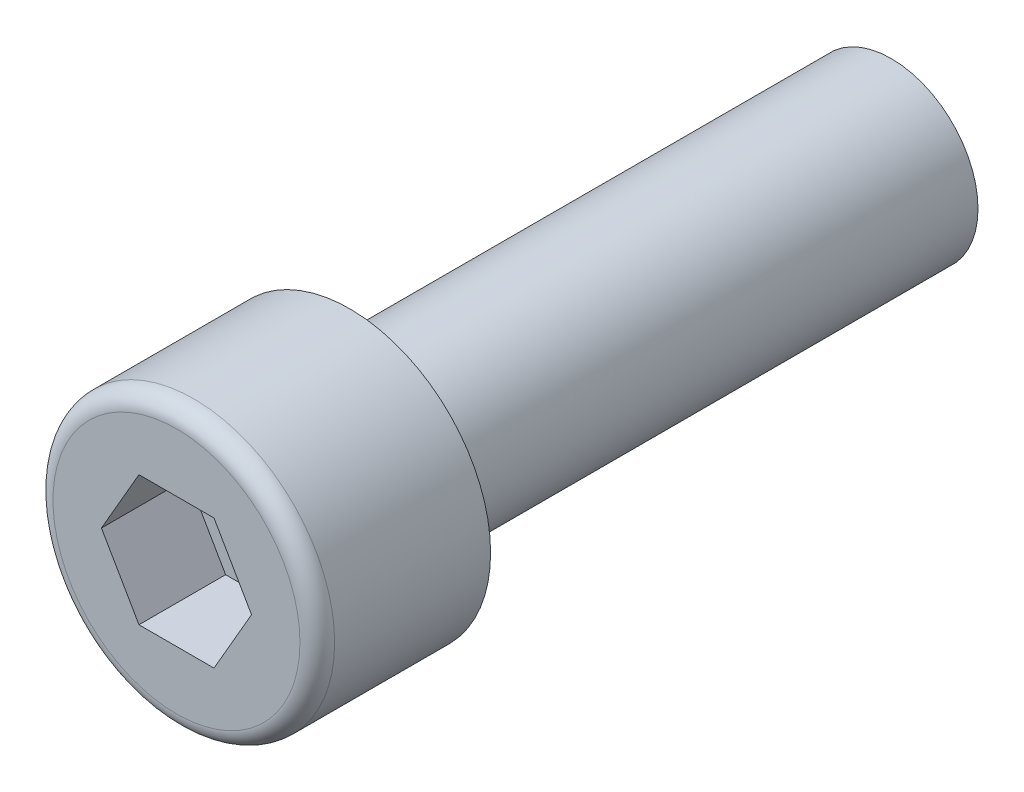
ISO-10303-21;
HEADER;
FILE_DESCRIPTION(('STEP AP214'),'2;1');
FILE_NAME('part.step','',(''),(''),'','','');
FILE_SCHEMA(('AUTOMOTIVE_DESIGN { 1 0 10303 214 1 1 1 1 }'));
ENDSEC;
DATA;
#1=APPLICATION_CONTEXT('core data for automotive mechanical design processes');
#2=APPLICATION_PROTOCOL_DEFINITION('international standard','automotive_design',2000,#1);
#3=PRODUCT_CONTEXT('',#1,'mechanical');
#4=PRODUCT('Part','Part','',(#3));
#5=PRODUCT_RELATED_PRODUCT_CATEGORY('part','',(#4));
#6=PRODUCT_DEFINITION_FORMATION('','',#4);
#7=PRODUCT_DEFINITION_CONTEXT('part definition',#1,'design');
#8=PRODUCT_DEFINITION('design','',#6,#7);
#9=PRODUCT_DEFINITION_SHAPE('','',#8);
#10=(LENGTH_UNIT() NAMED_UNIT(*) SI_UNIT(.MILLI.,.METRE.));
#11=(NAMED_UNIT(*) PLANE_ANGLE_UNIT() SI_UNIT($,.RADIAN.));
#12=(NAMED_UNIT(*) SI_UNIT($,.STERADIAN.) SOLID_ANGLE_UNIT());
#13=UNCERTAINTY_MEASURE_WITH_UNIT(LENGTH_MEASURE(1.E-05),#10,'distance_accuracy_value','');
#14=(GEOMETRIC_REPRESENTATION_CONTEXT(3) GLOBAL_UNCERTAINTY_ASSIGNED_CONTEXT((#13)) GLOBAL_UNIT_ASSIGNED_CONTEXT((#10,
#11,#12)) REPRESENTATION_CONTEXT('',''));
#15=CARTESIAN_POINT('',(0.,0.,0.));
#16=DIRECTION('',(0.,0.,1.));
#17=DIRECTION('',(1.,0.,0.));
#18=AXIS2_PLACEMENT_3D('',#15,#16,#17);
#19=CARTESIAN_POINT('',(0.,0.,8.));
#20=DIRECTION('',(0.,0.,1.));
#21=DIRECTION('',(1.,0.,0.));
#22=AXIS2_PLACEMENT_3D('',#19,#20,#21);
#23=PLANE('',#22);
#24=DIRECTION('',(-0.500000000000081,-0.866025403784392,0.));
#25=VECTOR('',#24,1.);
#26=CARTESIAN_POINT('',(-1.73205080786937,3.00000000017349,8.000000000254));
#27=LINE('',#26,#25);
#28=CARTESIAN_POINT('',(-1.73205080756888,3.,8.));
#29=VERTEX_POINT('',#28);
#30=CARTESIAN_POINT('',(-3.46410161513775,0.,8.));
#31=VERTEX_POINT('',#30);
#32=EDGE_CURVE('E82',#29,#31,#27,.T.);
#33=ORIENTED_EDGE('',*,*,#32,.F.);
#34=DIRECTION('',(-1.,0.,0.));
#35=VECTOR('',#34,1.);
#36=CARTESIAN_POINT('',(1.73205080756888,3.000000000254,8.000000000254));
#37=LINE('',#36,#35);
#38=CARTESIAN_POINT('',(1.73205080756888,3.,8.));
#39=VERTEX_POINT('',#38);
#40=EDGE_CURVE('E70',#39,#29,#37,.T.);
#41=ORIENTED_EDGE('',*,*,#40,.F.);
#42=DIRECTION('',(-0.50000000000008,0.866025403784392,0.));
#43=VECTOR('',#42,1.);
#44=CARTESIAN_POINT('',(3.46410161543824,1.73488829304525E-10,8.000000000254));
#45=LINE('',#44,#43);
#46=CARTESIAN_POINT('',(3.46410161513775,0.,8.));
#47=VERTEX_POINT('',#46);
#48=EDGE_CURVE('E81',#47,#39,#45,.T.);
#49=ORIENTED_EDGE('',*,*,#48,.F.);
#50=DIRECTION('',(0.500000000000081,0.866025403784392,0.));
#51=VECTOR('',#50,1.);
#52=CARTESIAN_POINT('',(1.73205080786937,-3.00000000017349,8.000000000254));
#53=LINE('',#52,#51);
#54=CARTESIAN_POINT('',(1.73205080756888,-3.,8.));
#55=VERTEX_POINT('',#54);
#56=EDGE_CURVE('E109',#55,#47,#53,.T.);
#57=ORIENTED_EDGE('',*,*,#56,.F.);
#58=DIRECTION('',(1.,2.54215667139907E-13,0.));
#59=VECTOR('',#58,1.);
#60=CARTESIAN_POINT('',(-1.73205080756888,-3.000000000254,8.000000000254));
#61=LINE('',#60,#59);
#62=CARTESIAN_POINT('',(-1.73205080756888,-3.,8.));
#63=VERTEX_POINT('',#62);
#64=EDGE_CURVE('E114',#63,#55,#61,.T.);
#65=ORIENTED_EDGE('',*,*,#64,.F.);
#66=DIRECTION('',(0.50000000000008,-0.866025403784392,0.));
#67=VECTOR('',#66,1.);
#68=CARTESIAN_POINT('',(-3.46410161521826,-4.64843630517229E-11,8.000000000254));
#69=LINE('',#68,#67);
#70=EDGE_CURVE('E96',#31,#63,#69,.T.);
#71=ORIENTED_EDGE('',*,*,#70,.F.);
#72=EDGE_LOOP('',(#33,#41,#49,#57,#65,#71));
#73=FACE_BOUND('',#72,.T.);
#74=CARTESIAN_POINT('',(0.,0.,8.));
#75=DIRECTION('',(0.,0.,1.));
#76=DIRECTION('',(1.,0.,0.));
#77=AXIS2_PLACEMENT_3D('',#74,#75,#76);
#78=CIRCLE('',#77,5.7);
#79=CARTESIAN_POINT('',(5.7,0.,8.));
#80=VERTEX_POINT('',#79);
#81=EDGE_CURVE('E123',#80,#80,#78,.T.);
#82=ORIENTED_EDGE('',*,*,#81,.T.);
#83=EDGE_LOOP('',(#82));
#84=FACE_BOUND('',#83,.T.);
#85=ADVANCED_FACE('F17',(#73,#84),#23,.T.);
#86=CARTESIAN_POINT('',(-1.73205080756888,3.,4.));
#87=DIRECTION('',(-0.866025403784439,0.5,0.));
#88=DIRECTION('',(0.,0.,1.));
#89=AXIS2_PLACEMENT_3D('',#86,#87,#88);
#90=PLANE('',#89);
#91=ORIENTED_EDGE('',*,*,#32,.T.);
#92=DIRECTION('',(0.,0.,1.));
#93=VECTOR('',#92,1.);
#94=CARTESIAN_POINT('',(-3.46410161539175,2.54000863062855E-10,4.));
#95=LINE('',#94,#93);
#96=CARTESIAN_POINT('',(-3.46410161513775,0.,4.));
#97=VERTEX_POINT('',#96);
#98=EDGE_CURVE('E129',#97,#31,#95,.T.);
#99=ORIENTED_EDGE('',*,*,#98,.F.);
#100=DIRECTION('',(-0.500000000000081,-0.866025403784392,0.));
#101=VECTOR('',#100,1.);
#102=CARTESIAN_POINT('',(-1.73205080786937,3.00000000017349,4.000000000254));
#103=LINE('',#102,#101);
#104=CARTESIAN_POINT('',(-1.73205080756888,3.,4.));
#105=VERTEX_POINT('',#104);
#106=EDGE_CURVE('E89',#105,#97,#103,.T.);
#107=ORIENTED_EDGE('',*,*,#106,.F.);
#108=DIRECTION('',(0.,0.,1.));
#109=VECTOR('',#108,1.);
#110=CARTESIAN_POINT('',(-1.73205080782288,3.000000000254,4.));
#111=LINE('',#110,#109);
#112=EDGE_CURVE('E74',#105,#29,#111,.T.);
#113=ORIENTED_EDGE('',*,*,#112,.T.);
#114=EDGE_LOOP('',(#91,#99,#107,#113));
#115=FACE_BOUND('',#114,.T.);
#116=ADVANCED_FACE('F87',(#115),#90,.F.);
#117=CARTESIAN_POINT('',(1.73205080756888,3.,4.));
#118=DIRECTION('',(0.,1.,0.));
#119=DIRECTION('',(1.,0.,0.));
#120=AXIS2_PLACEMENT_3D('',#117,#118,#119);
#121=PLANE('',#120);
#122=ORIENTED_EDGE('',*,*,#40,.T.);
#123=ORIENTED_EDGE('',*,*,#112,.F.);
#124=DIRECTION('',(-1.,0.,0.));
#125=VECTOR('',#124,1.);
#126=CARTESIAN_POINT('',(1.73205080756888,3.000000000254,4.000000000254));
#127=LINE('',#126,#125);
#128=CARTESIAN_POINT('',(1.73205080756888,3.,4.));
#129=VERTEX_POINT('',#128);
#130=EDGE_CURVE('E91',#129,#105,#127,.T.);
#131=ORIENTED_EDGE('',*,*,#130,.F.);
#132=DIRECTION('',(0.,0.,1.));
#133=VECTOR('',#132,1.);
#134=CARTESIAN_POINT('',(1.73205080782288,3.000000000254,4.));
#135=LINE('',#134,#133);
#136=EDGE_CURVE('E76',#129,#39,#135,.T.);
#137=ORIENTED_EDGE('',*,*,#136,.T.);
#138=EDGE_LOOP('',(#122,#123,#131,#137));
#139=FACE_BOUND('',#138,.T.);
#140=ADVANCED_FACE('F72',(#139),#121,.F.);
#141=CARTESIAN_POINT('',(3.46410161513775,0.,4.));
#142=DIRECTION('',(0.866025403784439,0.5,0.));
#143=DIRECTION('',(0.,0.,-1.));
#144=AXIS2_PLACEMENT_3D('',#141,#142,#143);
#145=PLANE('',#144);
#146=ORIENTED_EDGE('',*,*,#48,.T.);
#147=ORIENTED_EDGE('',*,*,#136,.F.);
#148=DIRECTION('',(-0.50000000000008,0.866025403784392,0.));
#149=VECTOR('',#148,1.);
#150=CARTESIAN_POINT('',(3.46410161543824,1.73488829304525E-10,4.000000000254));
#151=LINE('',#150,#149);
#152=CARTESIAN_POINT('',(3.46410161513775,0.,4.));
#153=VERTEX_POINT('',#152);
#154=EDGE_CURVE('E146',#153,#129,#151,.T.);
#155=ORIENTED_EDGE('',*,*,#154,.F.);
#156=DIRECTION('',(0.,0.,1.));
#157=VECTOR('',#156,1.);
#158=CARTESIAN_POINT('',(3.46410161539175,2.54003661575938E-10,4.));
#159=LINE('',#158,#157);
#160=EDGE_CURVE('E151',#153,#47,#159,.T.);
#161=ORIENTED_EDGE('',*,*,#160,.T.);
#162=EDGE_LOOP('',(#146,#147,#155,#161));
#163=FACE_BOUND('',#162,.T.);
#164=ADVANCED_FACE('F225',(#163),#145,.F.);
#165=CARTESIAN_POINT('',(1.73205080756888,-3.,4.));
#166=DIRECTION('',(0.866025403784439,-0.5,0.));
#167=DIRECTION('',(0.,0.,-1.));
#168=AXIS2_PLACEMENT_3D('',#165,#166,#167);
#169=PLANE('',#168);
#170=ORIENTED_EDGE('',*,*,#56,.T.);
#171=ORIENTED_EDGE('',*,*,#160,.F.);
#172=DIRECTION('',(0.500000000000081,0.866025403784392,0.));
#173=VECTOR('',#172,1.);
#174=CARTESIAN_POINT('',(1.73205080786937,-3.00000000017349,4.000000000254));
#175=LINE('',#174,#173);
#176=CARTESIAN_POINT('',(1.73205080756888,-3.,4.));
#177=VERTEX_POINT('',#176);
#178=EDGE_CURVE('E157',#177,#153,#175,.T.);
#179=ORIENTED_EDGE('',*,*,#178,.F.);
#180=DIRECTION('',(0.,0.,1.));
#181=VECTOR('',#180,1.);
#182=CARTESIAN_POINT('',(1.73205080782288,-3.000000000254,4.));
#183=LINE('',#182,#181);
#184=EDGE_CURVE('E162',#177,#55,#183,.T.);
#185=ORIENTED_EDGE('',*,*,#184,.T.);
#186=EDGE_LOOP('',(#170,#171,#179,#185));
#187=FACE_BOUND('',#186,.T.);
#188=ADVANCED_FACE('F228',(#187),#169,.F.);
#189=CARTESIAN_POINT('',(-1.73205080756888,-3.,4.));
#190=DIRECTION('',(0.,-1.,0.));
#191=DIRECTION('',(0.,0.,-1.));
#192=AXIS2_PLACEMENT_3D('',#189,#190,#191);
#193=PLANE('',#192);
#194=ORIENTED_EDGE('',*,*,#64,.T.);
#195=ORIENTED_EDGE('',*,*,#184,.F.);
#196=DIRECTION('',(1.,2.54215667139907E-13,0.));
#197=VECTOR('',#196,1.);
#198=CARTESIAN_POINT('',(-1.73205080756888,-3.000000000254,4.000000000254));
#199=LINE('',#198,#197);
#200=CARTESIAN_POINT('',(-1.73205080756888,-3.,4.));
#201=VERTEX_POINT('',#200);
#202=EDGE_CURVE('E37',#201,#177,#199,.T.);
#203=ORIENTED_EDGE('',*,*,#202,.F.);
#204=DIRECTION('',(0.,0.,1.));
#205=VECTOR('',#204,1.);
#206=CARTESIAN_POINT('',(-1.73205080782288,-3.000000000254,4.));
#207=LINE('',#206,#205);
#208=EDGE_CURVE('E172',#201,#63,#207,.T.);
#209=ORIENTED_EDGE('',*,*,#208,.T.);
#210=EDGE_LOOP('',(#194,#195,#203,#209));
#211=FACE_BOUND('',#210,.T.);
#212=ADVANCED_FACE('F232',(#211),#193,.F.);
#213=CARTESIAN_POINT('',(-3.46410161513775,0.,4.));
#214=DIRECTION('',(-0.866025403784439,-0.5,0.));
#215=DIRECTION('',(-0.5,0.866025403784439,0.));
#216=AXIS2_PLACEMENT_3D('',#213,#214,#215);
#217=PLANE('',#216);
#218=ORIENTED_EDGE('',*,*,#70,.T.);
#219=ORIENTED_EDGE('',*,*,#208,.F.);
#220=DIRECTION('',(0.50000000000008,-0.866025403784392,0.));
#221=VECTOR('',#220,1.);
#222=CARTESIAN_POINT('',(-3.46410161521826,-4.64843338587249E-11,4.000000000254));
#223=LINE('',#222,#221);
#224=EDGE_CURVE('E33',#97,#201,#223,.T.);
#225=ORIENTED_EDGE('',*,*,#224,.F.);
#226=ORIENTED_EDGE('',*,*,#98,.T.);
#227=EDGE_LOOP('',(#218,#219,#225,#226));
#228=FACE_BOUND('',#227,.T.);
#229=ADVANCED_FACE('F236',(#228),#217,.F.);
#230=CARTESIAN_POINT('',(0.,0.,7.2));
#231=DIRECTION('',(0.,0.,1.));
#232=DIRECTION('',(1.,0.,0.));
#233=AXIS2_PLACEMENT_3D('',#230,#231,#232);
#234=TOROIDAL_SURFACE('',#233,5.7,0.8);
#235=CARTESIAN_POINT('',(0.,0.,7.200000000254));
#236=DIRECTION('',(0.,0.,-1.));
#237=DIRECTION('',(1.,0.,0.));
#238=AXIS2_PLACEMENT_3D('',#235,#236,#237);
#239=CIRCLE('',#238,6.5);
#240=CARTESIAN_POINT('',(6.5,0.,7.200000000254));
#241=VERTEX_POINT('',#240);
#242=EDGE_CURVE('E182',#241,#241,#239,.T.);
#243=ORIENTED_EDGE('',*,*,#242,.F.);
#244=EDGE_LOOP('',(#243));
#245=FACE_BOUND('',#244,.T.);
#246=ORIENTED_EDGE('',*,*,#81,.F.);
#247=EDGE_LOOP('',(#246));
#248=FACE_BOUND('',#247,.T.);
#249=ADVANCED_FACE('F214',(#245,#248),#234,.T.);
#250=CARTESIAN_POINT('',(0.,0.,4.));
#251=DIRECTION('',(0.,0.,1.));
#252=DIRECTION('',(1.,0.,0.));
#253=AXIS2_PLACEMENT_3D('',#250,#251,#252);
#254=PLANE('',#253);
#255=ORIENTED_EDGE('',*,*,#106,.T.);
#256=ORIENTED_EDGE('',*,*,#224,.T.);
#257=ORIENTED_EDGE('',*,*,#202,.T.);
#258=ORIENTED_EDGE('',*,*,#178,.T.);
#259=ORIENTED_EDGE('',*,*,#154,.T.);
#260=ORIENTED_EDGE('',*,*,#130,.T.);
#261=EDGE_LOOP('',(#255,#256,#257,#258,#259,#260));
#262=FACE_BOUND('',#261,.T.);
#263=ADVANCED_FACE('F207',(#262),#254,.T.);
#264=CARTESIAN_POINT('',(0.,0.,8.));
#265=DIRECTION('',(0.,0.,1.));
#266=DIRECTION('',(-1.,0.,0.));
#267=AXIS2_PLACEMENT_3D('',#264,#265,#266);
#268=CYLINDRICAL_SURFACE('',#267,6.5);
#269=ORIENTED_EDGE('',*,*,#242,.T.);
#270=EDGE_LOOP('',(#269));
#271=FACE_BOUND('',#270,.T.);
#272=CARTESIAN_POINT('',(0.,0.,0.));
#273=DIRECTION('',(0.,0.,1.));
#274=DIRECTION('',(1.,0.,0.));
#275=AXIS2_PLACEMENT_3D('',#272,#273,#274);
#276=CIRCLE('',#275,6.5);
#277=CARTESIAN_POINT('',(6.5,0.,0.));
#278=VERTEX_POINT('',#277);
#279=EDGE_CURVE('E188',#278,#278,#276,.T.);
#280=ORIENTED_EDGE('',*,*,#279,.T.);
#281=EDGE_LOOP('',(#280));
#282=FACE_BOUND('',#281,.T.);
#283=ADVANCED_FACE('F202',(#271,#282),#268,.T.);
#284=CARTESIAN_POINT('',(0.,0.,0.));
#285=DIRECTION('',(0.,0.,1.));
#286=DIRECTION('',(1.,0.,0.));
#287=AXIS2_PLACEMENT_3D('',#284,#285,#286);
#288=PLANE('',#287);
#289=CARTESIAN_POINT('',(0.,0.,0.));
#290=DIRECTION('',(0.,0.,-1.));
#291=DIRECTION('',(1.,0.,0.));
#292=AXIS2_PLACEMENT_3D('',#289,#290,#291);
#293=CIRCLE('',#292,4.);
#294=CARTESIAN_POINT('',(4.,0.,0.));
#295=VERTEX_POINT('',#294);
#296=EDGE_CURVE('E26',#295,#295,#293,.T.);
#297=ORIENTED_EDGE('',*,*,#296,.F.);
#298=EDGE_LOOP('',(#297));
#299=FACE_BOUND('',#298,.T.);
#300=ORIENTED_EDGE('',*,*,#279,.F.);
#301=EDGE_LOOP('',(#300));
#302=FACE_BOUND('',#301,.T.);
#303=ADVANCED_FACE('F199',(#299,#302),#288,.F.);
#304=CARTESIAN_POINT('',(0.,0.,-25.));
#305=DIRECTION('',(0.,0.,-1.));
#306=DIRECTION('',(1.,0.,0.));
#307=AXIS2_PLACEMENT_3D('',#304,#305,#306);
#308=CYLINDRICAL_SURFACE('',#307,4.);
#309=CARTESIAN_POINT('',(0.,0.,-25.));
#310=DIRECTION('',(0.,0.,-1.));
#311=DIRECTION('',(-1.,0.,0.));
#312=AXIS2_PLACEMENT_3D('',#309,#310,#311);
#313=CIRCLE('',#312,4.);
#314=CARTESIAN_POINT('',(-4.,0.,-25.));
#315=VERTEX_POINT('',#314);
#316=EDGE_CURVE('E11',#315,#315,#313,.T.);
#317=ORIENTED_EDGE('',*,*,#316,.F.);
#318=EDGE_LOOP('',(#317));
#319=FACE_BOUND('',#318,.T.);
#320=ORIENTED_EDGE('',*,*,#296,.T.);
#321=EDGE_LOOP('',(#320));
#322=FACE_BOUND('',#321,.T.);
#323=ADVANCED_FACE('F197',(#319,#322),#308,.T.);
#324=CARTESIAN_POINT('',(0.,0.,-25.));
#325=DIRECTION('',(0.,0.,-1.));
#326=DIRECTION('',(0.,-1.,0.));
#327=AXIS2_PLACEMENT_3D('',#324,#325,#326);
#328=PLANE('',#327);
#329=ORIENTED_EDGE('',*,*,#316,.T.);
#330=EDGE_LOOP('',(#329));
#331=FACE_BOUND('',#330,.T.);
#332=ADVANCED_FACE('F19',(#331),#328,.T.);
#333=CLOSED_SHELL('',(#85,#116,#140,#164,#188,#212,#229,#249,#263,#283,#303,#323,#332));
#334=MANIFOLD_SOLID_BREP('B1',#333);
#335=ADVANCED_BREP_SHAPE_REPRESENTATION('',(#18,#334),#14);
#336=SHAPE_DEFINITION_REPRESENTATION(#9,#335);
ENDSEC;
END-ISO-10303-21;
